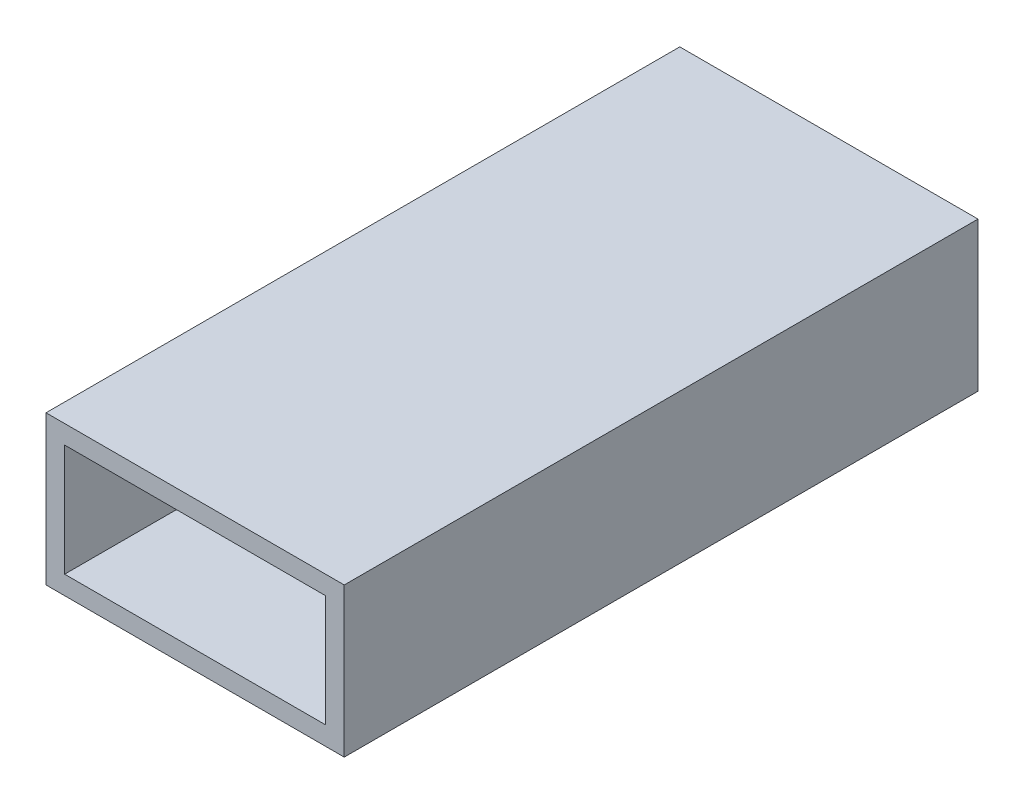
ISO-10303-21;
HEADER;
FILE_DESCRIPTION(('STEP AP214'),'2;1');
FILE_NAME('part.step','',(''),(''),'','','');
FILE_SCHEMA(('AUTOMOTIVE_DESIGN { 1 0 10303 214 1 1 1 1 }'));
ENDSEC;
DATA;
#1=APPLICATION_CONTEXT('core data for automotive mechanical design processes');
#2=APPLICATION_PROTOCOL_DEFINITION('international standard','automotive_design',2000,#1);
#3=PRODUCT_CONTEXT('',#1,'mechanical');
#4=PRODUCT('Part','Part','',(#3));
#5=PRODUCT_RELATED_PRODUCT_CATEGORY('part','',(#4));
#6=PRODUCT_DEFINITION_FORMATION('','',#4);
#7=PRODUCT_DEFINITION_CONTEXT('part definition',#1,'design');
#8=PRODUCT_DEFINITION('design','',#6,#7);
#9=PRODUCT_DEFINITION_SHAPE('','',#8);
#10=(LENGTH_UNIT() NAMED_UNIT(*) SI_UNIT(.MILLI.,.METRE.));
#11=(NAMED_UNIT(*) PLANE_ANGLE_UNIT() SI_UNIT($,.RADIAN.));
#12=(NAMED_UNIT(*) SI_UNIT($,.STERADIAN.) SOLID_ANGLE_UNIT());
#13=UNCERTAINTY_MEASURE_WITH_UNIT(LENGTH_MEASURE(1.E-05),#10,'distance_accuracy_value','');
#14=(GEOMETRIC_REPRESENTATION_CONTEXT(3) GLOBAL_UNCERTAINTY_ASSIGNED_CONTEXT((#13)) GLOBAL_UNIT_ASSIGNED_CONTEXT((#10,
#11,#12)) REPRESENTATION_CONTEXT('',''));
#15=CARTESIAN_POINT('',(0.,0.,0.));
#16=DIRECTION('',(0.,0.,1.));
#17=DIRECTION('',(1.,0.,0.));
#18=AXIS2_PLACEMENT_3D('',#15,#16,#17);
#19=CARTESIAN_POINT('',(0.,567.757532007204,107.95));
#20=DIRECTION('',(0.,1.,0.));
#21=DIRECTION('',(0.,0.,1.));
#22=AXIS2_PLACEMENT_3D('',#19,#20,#21);
#23=PLANE('',#22);
#24=DIRECTION('',(1.,0.,0.));
#25=VECTOR('',#24,1.);
#26=CARTESIAN_POINT('',(0.,567.757532007204,0.));
#27=LINE('',#26,#25);
#28=CARTESIAN_POINT('',(-990.720655188937,567.757532007204,0.));
#29=VERTEX_POINT('',#28);
#30=CARTESIAN_POINT('',(-939.920655188937,567.757532007204,0.));
#31=VERTEX_POINT('',#30);
#32=EDGE_CURVE('E129',#29,#31,#27,.T.);
#33=ORIENTED_EDGE('',*,*,#32,.F.);
#34=DIRECTION('',(0.,0.,-1.));
#35=VECTOR('',#34,1.);
#36=CARTESIAN_POINT('',(-990.720655188937,567.757532007204,107.95));
#37=LINE('',#36,#35);
#38=CARTESIAN_POINT('',(-990.720655188937,567.757532007204,107.95));
#39=VERTEX_POINT('',#38);
#40=EDGE_CURVE('E11',#39,#29,#37,.T.);
#41=ORIENTED_EDGE('',*,*,#40,.F.);
#42=DIRECTION('',(1.,0.,0.));
#43=VECTOR('',#42,1.);
#44=CARTESIAN_POINT('',(0.,567.757532007204,107.95));
#45=LINE('',#44,#43);
#46=CARTESIAN_POINT('',(-939.920655188937,567.757532007204,107.95));
#47=VERTEX_POINT('',#46);
#48=EDGE_CURVE('E133',#39,#47,#45,.T.);
#49=ORIENTED_EDGE('',*,*,#48,.T.);
#50=DIRECTION('',(0.,0.,-1.));
#51=VECTOR('',#50,1.);
#52=CARTESIAN_POINT('',(-939.920655188937,567.757532007204,107.95));
#53=LINE('',#52,#51);
#54=EDGE_CURVE('E144',#47,#31,#53,.T.);
#55=ORIENTED_EDGE('',*,*,#54,.T.);
#56=EDGE_LOOP('',(#33,#41,#49,#55));
#57=FACE_BOUND('',#56,.T.);
#58=ADVANCED_FACE('F33',(#57),#23,.T.);
#59=CARTESIAN_POINT('',(-990.720655188937,0.,107.95));
#60=DIRECTION('',(1.,0.,0.));
#61=DIRECTION('',(0.,0.,-1.));
#62=AXIS2_PLACEMENT_3D('',#59,#60,#61);
#63=PLANE('',#62);
#64=DIRECTION('',(0.,-1.,0.));
#65=VECTOR('',#64,1.);
#66=CARTESIAN_POINT('',(-990.720655188937,0.,0.));
#67=LINE('',#66,#65);
#68=CARTESIAN_POINT('',(-990.720655188937,542.357532007237,0.));
#69=VERTEX_POINT('',#68);
#70=EDGE_CURVE('E147',#29,#69,#67,.T.);
#71=ORIENTED_EDGE('',*,*,#70,.T.);
#72=DIRECTION('',(0.,0.,-1.));
#73=VECTOR('',#72,1.);
#74=CARTESIAN_POINT('',(-990.720655188937,542.357532007237,107.95));
#75=LINE('',#74,#73);
#76=CARTESIAN_POINT('',(-990.720655188937,542.357532007237,107.95));
#77=VERTEX_POINT('',#76);
#78=EDGE_CURVE('E40',#77,#69,#75,.T.);
#79=ORIENTED_EDGE('',*,*,#78,.F.);
#80=DIRECTION('',(0.,-1.,0.));
#81=VECTOR('',#80,1.);
#82=CARTESIAN_POINT('',(-990.720655188937,0.,107.95));
#83=LINE('',#82,#81);
#84=EDGE_CURVE('E136',#39,#77,#83,.T.);
#85=ORIENTED_EDGE('',*,*,#84,.F.);
#86=ORIENTED_EDGE('',*,*,#40,.T.);
#87=EDGE_LOOP('',(#71,#79,#85,#86));
#88=FACE_BOUND('',#87,.T.);
#89=ADVANCED_FACE('F174',(#88),#63,.F.);
#90=CARTESIAN_POINT('',(0.,542.357532007237,107.95));
#91=DIRECTION('',(0.,1.,0.));
#92=DIRECTION('',(0.,0.,1.));
#93=AXIS2_PLACEMENT_3D('',#90,#91,#92);
#94=PLANE('',#93);
#95=DIRECTION('',(1.,0.,0.));
#96=VECTOR('',#95,1.);
#97=CARTESIAN_POINT('',(0.,542.357532007237,0.));
#98=LINE('',#97,#96);
#99=CARTESIAN_POINT('',(-939.920655188937,542.357532007237,0.));
#100=VERTEX_POINT('',#99);
#101=EDGE_CURVE('E149',#69,#100,#98,.T.);
#102=ORIENTED_EDGE('',*,*,#101,.T.);
#103=DIRECTION('',(0.,0.,-1.));
#104=VECTOR('',#103,1.);
#105=CARTESIAN_POINT('',(-939.920655188937,542.357532007237,107.95));
#106=LINE('',#105,#104);
#107=CARTESIAN_POINT('',(-939.920655188937,542.357532007237,107.95));
#108=VERTEX_POINT('',#107);
#109=EDGE_CURVE('E155',#108,#100,#106,.T.);
#110=ORIENTED_EDGE('',*,*,#109,.F.);
#111=DIRECTION('',(1.,0.,0.));
#112=VECTOR('',#111,1.);
#113=CARTESIAN_POINT('',(0.,542.357532007237,107.95));
#114=LINE('',#113,#112);
#115=EDGE_CURVE('E139',#77,#108,#114,.T.);
#116=ORIENTED_EDGE('',*,*,#115,.F.);
#117=ORIENTED_EDGE('',*,*,#78,.T.);
#118=EDGE_LOOP('',(#102,#110,#116,#117));
#119=FACE_BOUND('',#118,.T.);
#120=ADVANCED_FACE('F161',(#119),#94,.F.);
#121=CARTESIAN_POINT('',(-939.920655188937,0.,107.95));
#122=DIRECTION('',(1.,0.,0.));
#123=DIRECTION('',(0.,0.,-1.));
#124=AXIS2_PLACEMENT_3D('',#121,#122,#123);
#125=PLANE('',#124);
#126=DIRECTION('',(0.,-1.,0.));
#127=VECTOR('',#126,1.);
#128=CARTESIAN_POINT('',(-939.920655188937,0.,0.));
#129=LINE('',#128,#127);
#130=EDGE_CURVE('E137',#31,#100,#129,.T.);
#131=ORIENTED_EDGE('',*,*,#130,.F.);
#132=ORIENTED_EDGE('',*,*,#54,.F.);
#133=DIRECTION('',(0.,-1.,0.));
#134=VECTOR('',#133,1.);
#135=CARTESIAN_POINT('',(-939.920655188937,0.,107.95));
#136=LINE('',#135,#134);
#137=EDGE_CURVE('E141',#47,#108,#136,.T.);
#138=ORIENTED_EDGE('',*,*,#137,.T.);
#139=ORIENTED_EDGE('',*,*,#109,.T.);
#140=EDGE_LOOP('',(#131,#132,#138,#139));
#141=FACE_BOUND('',#140,.T.);
#142=ADVANCED_FACE('F169',(#141),#125,.T.);
#143=CARTESIAN_POINT('',(0.,0.,107.95));
#144=DIRECTION('',(0.,0.,1.));
#145=DIRECTION('',(1.,0.,0.));
#146=AXIS2_PLACEMENT_3D('',#143,#144,#145);
#147=PLANE('',#146);
#148=DIRECTION('',(0.,-1.,0.));
#149=VECTOR('',#148,1.);
#150=CARTESIAN_POINT('',(-987.545655188937,564.582532007204,107.95));
#151=LINE('',#150,#149);
#152=CARTESIAN_POINT('',(-987.545655188937,564.582532007204,107.95));
#153=VERTEX_POINT('',#152);
#154=CARTESIAN_POINT('',(-987.545655188937,545.532532007236,107.95));
#155=VERTEX_POINT('',#154);
#156=EDGE_CURVE('E47',#153,#155,#151,.T.);
#157=ORIENTED_EDGE('',*,*,#156,.F.);
#158=DIRECTION('',(-1.,0.,0.));
#159=VECTOR('',#158,1.);
#160=CARTESIAN_POINT('',(-987.545655188937,564.582532007204,107.95));
#161=LINE('',#160,#159);
#162=CARTESIAN_POINT('',(-943.095655188937,564.582532007204,107.95));
#163=VERTEX_POINT('',#162);
#164=EDGE_CURVE('E114',#163,#153,#161,.T.);
#165=ORIENTED_EDGE('',*,*,#164,.F.);
#166=DIRECTION('',(0.,1.,0.));
#167=VECTOR('',#166,1.);
#168=CARTESIAN_POINT('',(-943.095655188937,564.582532007204,107.95));
#169=LINE('',#168,#167);
#170=CARTESIAN_POINT('',(-943.095655188937,545.532532007236,107.95));
#171=VERTEX_POINT('',#170);
#172=EDGE_CURVE('E117',#171,#163,#169,.T.);
#173=ORIENTED_EDGE('',*,*,#172,.F.);
#174=DIRECTION('',(1.,0.,0.));
#175=VECTOR('',#174,1.);
#176=CARTESIAN_POINT('',(-987.545655188937,545.532532007236,107.95));
#177=LINE('',#176,#175);
#178=EDGE_CURVE('E123',#155,#171,#177,.T.);
#179=ORIENTED_EDGE('',*,*,#178,.F.);
#180=EDGE_LOOP('',(#157,#165,#173,#179));
#181=FACE_BOUND('',#180,.T.);
#182=ORIENTED_EDGE('',*,*,#48,.F.);
#183=ORIENTED_EDGE('',*,*,#84,.T.);
#184=ORIENTED_EDGE('',*,*,#115,.T.);
#185=ORIENTED_EDGE('',*,*,#137,.F.);
#186=EDGE_LOOP('',(#182,#183,#184,#185));
#187=FACE_BOUND('',#186,.T.);
#188=ADVANCED_FACE('F173',(#181,#187),#147,.T.);
#189=CARTESIAN_POINT('',(0.,0.,0.));
#190=DIRECTION('',(0.,0.,1.));
#191=DIRECTION('',(1.,0.,0.));
#192=AXIS2_PLACEMENT_3D('',#189,#190,#191);
#193=PLANE('',#192);
#194=DIRECTION('',(-1.,0.,0.));
#195=VECTOR('',#194,1.);
#196=CARTESIAN_POINT('',(-987.545655188937,564.582532007204,0.));
#197=LINE('',#196,#195);
#198=CARTESIAN_POINT('',(-943.095655188937,564.582532007204,0.));
#199=VERTEX_POINT('',#198);
#200=CARTESIAN_POINT('',(-987.545655188937,564.582532007204,0.));
#201=VERTEX_POINT('',#200);
#202=EDGE_CURVE('E104',#199,#201,#197,.T.);
#203=ORIENTED_EDGE('',*,*,#202,.T.);
#204=DIRECTION('',(0.,-1.,0.));
#205=VECTOR('',#204,1.);
#206=CARTESIAN_POINT('',(-987.545655188937,564.582532007204,0.));
#207=LINE('',#206,#205);
#208=CARTESIAN_POINT('',(-987.545655188937,545.532532007236,0.));
#209=VERTEX_POINT('',#208);
#210=EDGE_CURVE('E98',#201,#209,#207,.T.);
#211=ORIENTED_EDGE('',*,*,#210,.T.);
#212=DIRECTION('',(1.,0.,0.));
#213=VECTOR('',#212,1.);
#214=CARTESIAN_POINT('',(-987.545655188937,545.532532007236,0.));
#215=LINE('',#214,#213);
#216=CARTESIAN_POINT('',(-943.095655188937,545.532532007236,0.));
#217=VERTEX_POINT('',#216);
#218=EDGE_CURVE('E107',#209,#217,#215,.T.);
#219=ORIENTED_EDGE('',*,*,#218,.T.);
#220=DIRECTION('',(0.,1.,0.));
#221=VECTOR('',#220,1.);
#222=CARTESIAN_POINT('',(-943.095655188937,564.582532007204,0.));
#223=LINE('',#222,#221);
#224=EDGE_CURVE('E55',#217,#199,#223,.T.);
#225=ORIENTED_EDGE('',*,*,#224,.T.);
#226=EDGE_LOOP('',(#203,#211,#219,#225));
#227=FACE_BOUND('',#226,.T.);
#228=ORIENTED_EDGE('',*,*,#32,.T.);
#229=ORIENTED_EDGE('',*,*,#130,.T.);
#230=ORIENTED_EDGE('',*,*,#101,.F.);
#231=ORIENTED_EDGE('',*,*,#70,.F.);
#232=EDGE_LOOP('',(#228,#229,#230,#231));
#233=FACE_BOUND('',#232,.T.);
#234=ADVANCED_FACE('F111',(#227,#233),#193,.F.);
#235=CARTESIAN_POINT('',(-987.545655188937,564.582532007204,0.));
#236=DIRECTION('',(-1.,0.,0.));
#237=DIRECTION('',(0.,0.,1.));
#238=AXIS2_PLACEMENT_3D('',#235,#236,#237);
#239=PLANE('',#238);
#240=ORIENTED_EDGE('',*,*,#156,.T.);
#241=DIRECTION('',(0.,0.,1.));
#242=VECTOR('',#241,1.);
#243=CARTESIAN_POINT('',(-987.545655188937,545.532532007236,0.));
#244=LINE('',#243,#242);
#245=EDGE_CURVE('E94',#209,#155,#244,.T.);
#246=ORIENTED_EDGE('',*,*,#245,.F.);
#247=ORIENTED_EDGE('',*,*,#210,.F.);
#248=DIRECTION('',(0.,0.,1.));
#249=VECTOR('',#248,1.);
#250=CARTESIAN_POINT('',(-987.545655188937,564.582532007204,0.));
#251=LINE('',#250,#249);
#252=EDGE_CURVE('E127',#201,#153,#251,.T.);
#253=ORIENTED_EDGE('',*,*,#252,.T.);
#254=EDGE_LOOP('',(#240,#246,#247,#253));
#255=FACE_BOUND('',#254,.T.);
#256=ADVANCED_FACE('F96',(#255),#239,.F.);
#257=CARTESIAN_POINT('',(-987.545655188937,564.582532007204,0.));
#258=DIRECTION('',(0.,1.,0.));
#259=DIRECTION('',(0.,0.,1.));
#260=AXIS2_PLACEMENT_3D('',#257,#258,#259);
#261=PLANE('',#260);
#262=ORIENTED_EDGE('',*,*,#164,.T.);
#263=ORIENTED_EDGE('',*,*,#252,.F.);
#264=ORIENTED_EDGE('',*,*,#202,.F.);
#265=DIRECTION('',(0.,0.,1.));
#266=VECTOR('',#265,1.);
#267=CARTESIAN_POINT('',(-943.095655188937,564.582532007204,0.));
#268=LINE('',#267,#266);
#269=EDGE_CURVE('E130',#199,#163,#268,.T.);
#270=ORIENTED_EDGE('',*,*,#269,.T.);
#271=EDGE_LOOP('',(#262,#263,#264,#270));
#272=FACE_BOUND('',#271,.T.);
#273=ADVANCED_FACE('F194',(#272),#261,.F.);
#274=CARTESIAN_POINT('',(-943.095655188937,564.582532007204,0.));
#275=DIRECTION('',(1.,0.,0.));
#276=DIRECTION('',(0.,0.,-1.));
#277=AXIS2_PLACEMENT_3D('',#274,#275,#276);
#278=PLANE('',#277);
#279=ORIENTED_EDGE('',*,*,#172,.T.);
#280=ORIENTED_EDGE('',*,*,#269,.F.);
#281=ORIENTED_EDGE('',*,*,#224,.F.);
#282=DIRECTION('',(0.,0.,1.));
#283=VECTOR('',#282,1.);
#284=CARTESIAN_POINT('',(-943.095655188937,545.532532007236,0.));
#285=LINE('',#284,#283);
#286=EDGE_CURVE('E103',#217,#171,#285,.T.);
#287=ORIENTED_EDGE('',*,*,#286,.T.);
#288=EDGE_LOOP('',(#279,#280,#281,#287));
#289=FACE_BOUND('',#288,.T.);
#290=ADVANCED_FACE('F197',(#289),#278,.F.);
#291=CARTESIAN_POINT('',(-987.545655188937,545.532532007236,0.));
#292=DIRECTION('',(0.,-1.,0.));
#293=DIRECTION('',(0.,0.,-1.));
#294=AXIS2_PLACEMENT_3D('',#291,#292,#293);
#295=PLANE('',#294);
#296=ORIENTED_EDGE('',*,*,#178,.T.);
#297=ORIENTED_EDGE('',*,*,#286,.F.);
#298=ORIENTED_EDGE('',*,*,#218,.F.);
#299=ORIENTED_EDGE('',*,*,#245,.T.);
#300=EDGE_LOOP('',(#296,#297,#298,#299));
#301=FACE_BOUND('',#300,.T.);
#302=ADVANCED_FACE('F108',(#301),#295,.F.);
#303=CLOSED_SHELL('',(#58,#89,#120,#142,#188,#234,#256,#273,#290,#302));
#304=MANIFOLD_SOLID_BREP('B2',#303);
#305=ADVANCED_BREP_SHAPE_REPRESENTATION('',(#18,#304),#14);
#306=SHAPE_DEFINITION_REPRESENTATION(#9,#305);
ENDSEC;
END-ISO-10303-21;
